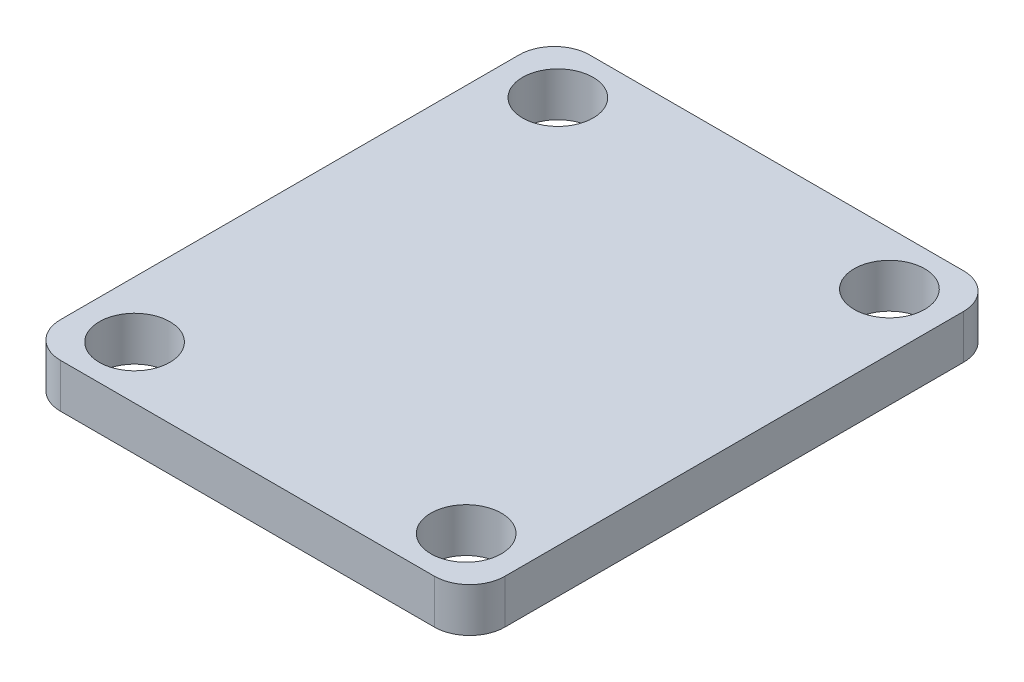
ISO-10303-21;
HEADER;
FILE_DESCRIPTION(('STEP AP214'),'2;1');
FILE_NAME('part.step','',(''),(''),'','','');
FILE_SCHEMA(('AUTOMOTIVE_DESIGN { 1 0 10303 214 1 1 1 1 }'));
ENDSEC;
DATA;
#1=APPLICATION_CONTEXT('core data for automotive mechanical design processes');
#2=APPLICATION_PROTOCOL_DEFINITION('international standard','automotive_design',2000,#1);
#3=PRODUCT_CONTEXT('',#1,'mechanical');
#4=PRODUCT('Part','Part','',(#3));
#5=PRODUCT_RELATED_PRODUCT_CATEGORY('part','',(#4));
#6=PRODUCT_DEFINITION_FORMATION('','',#4);
#7=PRODUCT_DEFINITION_CONTEXT('part definition',#1,'design');
#8=PRODUCT_DEFINITION('design','',#6,#7);
#9=PRODUCT_DEFINITION_SHAPE('','',#8);
#10=(LENGTH_UNIT() NAMED_UNIT(*) SI_UNIT(.MILLI.,.METRE.));
#11=(NAMED_UNIT(*) PLANE_ANGLE_UNIT() SI_UNIT($,.RADIAN.));
#12=(NAMED_UNIT(*) SI_UNIT($,.STERADIAN.) SOLID_ANGLE_UNIT());
#13=UNCERTAINTY_MEASURE_WITH_UNIT(LENGTH_MEASURE(1.E-05),#10,'distance_accuracy_value','');
#14=(GEOMETRIC_REPRESENTATION_CONTEXT(3) GLOBAL_UNCERTAINTY_ASSIGNED_CONTEXT((#13)) GLOBAL_UNIT_ASSIGNED_CONTEXT((#10,
#11,#12)) REPRESENTATION_CONTEXT('',''));
#15=CARTESIAN_POINT('',(0.,0.,0.));
#16=DIRECTION('',(0.,0.,1.));
#17=DIRECTION('',(1.,0.,0.));
#18=AXIS2_PLACEMENT_3D('',#15,#16,#17);
#19=CARTESIAN_POINT('',(-16.002,-3.175,19.05));
#20=DIRECTION('',(-1.,0.,0.));
#21=DIRECTION('',(0.,0.,1.));
#22=AXIS2_PLACEMENT_3D('',#19,#20,#21);
#23=PLANE('',#22);
#24=DIRECTION('',(0.,0.,1.));
#25=VECTOR('',#24,1.);
#26=CARTESIAN_POINT('',(-16.002,-3.175,19.05));
#27=LINE('',#26,#25);
#28=CARTESIAN_POINT('',(-16.002,-3.175,-16.51));
#29=VERTEX_POINT('',#28);
#30=CARTESIAN_POINT('',(-16.002,-3.175,16.51));
#31=VERTEX_POINT('',#30);
#32=EDGE_CURVE('E171',#29,#31,#27,.T.);
#33=ORIENTED_EDGE('',*,*,#32,.T.);
#34=DIRECTION('',(0.,1.,0.));
#35=VECTOR('',#34,1.);
#36=CARTESIAN_POINT('',(-16.002,-3.175,16.51));
#37=LINE('',#36,#35);
#38=CARTESIAN_POINT('',(-16.002,0.,16.51));
#39=VERTEX_POINT('',#38);
#40=EDGE_CURVE('E125',#31,#39,#37,.T.);
#41=ORIENTED_EDGE('',*,*,#40,.T.);
#42=DIRECTION('',(0.,0.,1.));
#43=VECTOR('',#42,1.);
#44=CARTESIAN_POINT('',(-16.002,0.,19.05));
#45=LINE('',#44,#43);
#46=CARTESIAN_POINT('',(-16.002,0.,-16.51));
#47=VERTEX_POINT('',#46);
#48=EDGE_CURVE('E109',#47,#39,#45,.T.);
#49=ORIENTED_EDGE('',*,*,#48,.F.);
#50=DIRECTION('',(0.,1.,0.));
#51=VECTOR('',#50,1.);
#52=CARTESIAN_POINT('',(-16.002,-3.175,-16.51));
#53=LINE('',#52,#51);
#54=EDGE_CURVE('E122',#47,#29,#53,.F.);
#55=ORIENTED_EDGE('',*,*,#54,.T.);
#56=EDGE_LOOP('',(#33,#41,#49,#55));
#57=FACE_BOUND('',#56,.T.);
#58=ADVANCED_FACE('F40',(#57),#23,.T.);
#59=CARTESIAN_POINT('',(16.002,-3.175,-19.05));
#60=DIRECTION('',(0.,0.,-1.));
#61=DIRECTION('',(-1.,0.,0.));
#62=AXIS2_PLACEMENT_3D('',#59,#60,#61);
#63=PLANE('',#62);
#64=DIRECTION('',(-1.,0.,0.));
#65=VECTOR('',#64,1.);
#66=CARTESIAN_POINT('',(16.002,-3.175,-19.05));
#67=LINE('',#66,#65);
#68=CARTESIAN_POINT('',(13.462,-3.175,-19.05));
#69=VERTEX_POINT('',#68);
#70=CARTESIAN_POINT('',(-13.462,-3.175,-19.05));
#71=VERTEX_POINT('',#70);
#72=EDGE_CURVE('E132',#69,#71,#67,.T.);
#73=ORIENTED_EDGE('',*,*,#72,.T.);
#74=DIRECTION('',(0.,1.,0.));
#75=VECTOR('',#74,1.);
#76=CARTESIAN_POINT('',(-13.462,-3.175,-19.05));
#77=LINE('',#76,#75);
#78=CARTESIAN_POINT('',(-13.462,0.,-19.05));
#79=VERTEX_POINT('',#78);
#80=EDGE_CURVE('E158',#71,#79,#77,.T.);
#81=ORIENTED_EDGE('',*,*,#80,.T.);
#82=DIRECTION('',(-1.,0.,0.));
#83=VECTOR('',#82,1.);
#84=CARTESIAN_POINT('',(16.002,0.,-19.05));
#85=LINE('',#84,#83);
#86=CARTESIAN_POINT('',(13.462,0.,-19.05));
#87=VERTEX_POINT('',#86);
#88=EDGE_CURVE('E111',#87,#79,#85,.T.);
#89=ORIENTED_EDGE('',*,*,#88,.F.);
#90=DIRECTION('',(0.,1.,0.));
#91=VECTOR('',#90,1.);
#92=CARTESIAN_POINT('',(13.462,-3.175,-19.05));
#93=LINE('',#92,#91);
#94=EDGE_CURVE('E156',#87,#69,#93,.F.);
#95=ORIENTED_EDGE('',*,*,#94,.T.);
#96=EDGE_LOOP('',(#73,#81,#89,#95));
#97=FACE_BOUND('',#96,.T.);
#98=ADVANCED_FACE('F160',(#97),#63,.T.);
#99=CARTESIAN_POINT('',(16.002,-3.175,19.05));
#100=DIRECTION('',(1.,0.,0.));
#101=DIRECTION('',(0.,0.,-1.));
#102=AXIS2_PLACEMENT_3D('',#99,#100,#101);
#103=PLANE('',#102);
#104=DIRECTION('',(0.,0.,-1.));
#105=VECTOR('',#104,1.);
#106=CARTESIAN_POINT('',(16.002,-3.175,19.05));
#107=LINE('',#106,#105);
#108=CARTESIAN_POINT('',(16.002,-3.175,16.51));
#109=VERTEX_POINT('',#108);
#110=CARTESIAN_POINT('',(16.002,-3.175,-16.51));
#111=VERTEX_POINT('',#110);
#112=EDGE_CURVE('E137',#109,#111,#107,.T.);
#113=ORIENTED_EDGE('',*,*,#112,.T.);
#114=DIRECTION('',(0.,1.,0.));
#115=VECTOR('',#114,1.);
#116=CARTESIAN_POINT('',(16.002,-3.175,-16.51));
#117=LINE('',#116,#115);
#118=CARTESIAN_POINT('',(16.002,0.,-16.51));
#119=VERTEX_POINT('',#118);
#120=EDGE_CURVE('E11',#111,#119,#117,.T.);
#121=ORIENTED_EDGE('',*,*,#120,.T.);
#122=DIRECTION('',(0.,0.,-1.));
#123=VECTOR('',#122,1.);
#124=CARTESIAN_POINT('',(16.002,0.,19.05));
#125=LINE('',#124,#123);
#126=CARTESIAN_POINT('',(16.002,0.,16.51));
#127=VERTEX_POINT('',#126);
#128=EDGE_CURVE('E169',#127,#119,#125,.T.);
#129=ORIENTED_EDGE('',*,*,#128,.F.);
#130=DIRECTION('',(0.,1.,0.));
#131=VECTOR('',#130,1.);
#132=CARTESIAN_POINT('',(16.002,-3.175,16.51));
#133=LINE('',#132,#131);
#134=EDGE_CURVE('E48',#127,#109,#133,.F.);
#135=ORIENTED_EDGE('',*,*,#134,.T.);
#136=EDGE_LOOP('',(#113,#121,#129,#135));
#137=FACE_BOUND('',#136,.T.);
#138=ADVANCED_FACE('F168',(#137),#103,.T.);
#139=CARTESIAN_POINT('',(16.002,-3.175,19.05));
#140=DIRECTION('',(0.,0.,1.));
#141=DIRECTION('',(1.,0.,0.));
#142=AXIS2_PLACEMENT_3D('',#139,#140,#141);
#143=PLANE('',#142);
#144=DIRECTION('',(1.,0.,0.));
#145=VECTOR('',#144,1.);
#146=CARTESIAN_POINT('',(16.002,0.,19.05));
#147=LINE('',#146,#145);
#148=CARTESIAN_POINT('',(-13.462,0.,19.05));
#149=VERTEX_POINT('',#148);
#150=CARTESIAN_POINT('',(13.462,0.,19.05));
#151=VERTEX_POINT('',#150);
#152=EDGE_CURVE('E126',#149,#151,#147,.T.);
#153=ORIENTED_EDGE('',*,*,#152,.F.);
#154=DIRECTION('',(0.,1.,0.));
#155=VECTOR('',#154,1.);
#156=CARTESIAN_POINT('',(-13.462,-3.175,19.05));
#157=LINE('',#156,#155);
#158=CARTESIAN_POINT('',(-13.462,-3.175,19.05));
#159=VERTEX_POINT('',#158);
#160=EDGE_CURVE('E148',#149,#159,#157,.F.);
#161=ORIENTED_EDGE('',*,*,#160,.T.);
#162=DIRECTION('',(1.,0.,0.));
#163=VECTOR('',#162,1.);
#164=CARTESIAN_POINT('',(16.002,-3.175,19.05));
#165=LINE('',#164,#163);
#166=CARTESIAN_POINT('',(13.462,-3.175,19.05));
#167=VERTEX_POINT('',#166);
#168=EDGE_CURVE('E175',#159,#167,#165,.T.);
#169=ORIENTED_EDGE('',*,*,#168,.T.);
#170=DIRECTION('',(0.,1.,0.));
#171=VECTOR('',#170,1.);
#172=CARTESIAN_POINT('',(13.462,-3.175,19.05));
#173=LINE('',#172,#171);
#174=EDGE_CURVE('E145',#167,#151,#173,.T.);
#175=ORIENTED_EDGE('',*,*,#174,.T.);
#176=EDGE_LOOP('',(#153,#161,#169,#175));
#177=FACE_BOUND('',#176,.T.);
#178=ADVANCED_FACE('F235',(#177),#143,.T.);
#179=CARTESIAN_POINT('',(0.,-3.175,0.));
#180=DIRECTION('',(0.,1.,0.));
#181=DIRECTION('',(0.,0.,1.));
#182=AXIS2_PLACEMENT_3D('',#179,#180,#181);
#183=PLANE('',#182);
#184=CARTESIAN_POINT('',(11.938,-3.175,15.24));
#185=DIRECTION('',(0.,1.,0.));
#186=DIRECTION('',(0.,0.,1.));
#187=AXIS2_PLACEMENT_3D('',#184,#185,#186);
#188=CIRCLE('',#187,2.54);
#189=CARTESIAN_POINT('',(11.938,-3.175,17.78));
#190=VERTEX_POINT('',#189);
#191=EDGE_CURVE('E188',#190,#190,#188,.T.);
#192=ORIENTED_EDGE('',*,*,#191,.T.);
#193=EDGE_LOOP('',(#192));
#194=FACE_BOUND('',#193,.T.);
#195=CARTESIAN_POINT('',(-11.938,-3.175,15.24));
#196=DIRECTION('',(0.,1.,0.));
#197=DIRECTION('',(0.,0.,1.));
#198=AXIS2_PLACEMENT_3D('',#195,#196,#197);
#199=CIRCLE('',#198,2.54);
#200=CARTESIAN_POINT('',(-11.938,-3.175,17.78));
#201=VERTEX_POINT('',#200);
#202=EDGE_CURVE('E194',#201,#201,#199,.T.);
#203=ORIENTED_EDGE('',*,*,#202,.T.);
#204=EDGE_LOOP('',(#203));
#205=FACE_BOUND('',#204,.T.);
#206=CARTESIAN_POINT('',(-11.938,-3.175,-15.24));
#207=DIRECTION('',(0.,1.,0.));
#208=DIRECTION('',(0.,0.,1.));
#209=AXIS2_PLACEMENT_3D('',#206,#207,#208);
#210=CIRCLE('',#209,2.54);
#211=CARTESIAN_POINT('',(-11.938,-3.175,-12.7));
#212=VERTEX_POINT('',#211);
#213=EDGE_CURVE('E182',#212,#212,#210,.T.);
#214=ORIENTED_EDGE('',*,*,#213,.T.);
#215=EDGE_LOOP('',(#214));
#216=FACE_BOUND('',#215,.T.);
#217=CARTESIAN_POINT('',(11.938,-3.175,-15.24));
#218=DIRECTION('',(0.,1.,0.));
#219=DIRECTION('',(0.,0.,1.));
#220=AXIS2_PLACEMENT_3D('',#217,#218,#219);
#221=CIRCLE('',#220,2.54);
#222=CARTESIAN_POINT('',(11.938,-3.175,-12.7));
#223=VERTEX_POINT('',#222);
#224=EDGE_CURVE('E127',#223,#223,#221,.T.);
#225=ORIENTED_EDGE('',*,*,#224,.T.);
#226=EDGE_LOOP('',(#225));
#227=FACE_BOUND('',#226,.T.);
#228=ORIENTED_EDGE('',*,*,#168,.F.);
#229=CARTESIAN_POINT('',(-13.462,-3.175,16.51));
#230=DIRECTION('',(0.,1.,0.));
#231=DIRECTION('',(0.,0.,1.));
#232=AXIS2_PLACEMENT_3D('',#229,#230,#231);
#233=CIRCLE('',#232,2.54);
#234=EDGE_CURVE('E154',#159,#31,#233,.F.);
#235=ORIENTED_EDGE('',*,*,#234,.T.);
#236=ORIENTED_EDGE('',*,*,#32,.F.);
#237=CARTESIAN_POINT('',(-13.462,-3.175,-16.51));
#238=DIRECTION('',(0.,1.,0.));
#239=DIRECTION('',(0.,0.,1.));
#240=AXIS2_PLACEMENT_3D('',#237,#238,#239);
#241=CIRCLE('',#240,2.54);
#242=EDGE_CURVE('E131',#29,#71,#241,.F.);
#243=ORIENTED_EDGE('',*,*,#242,.T.);
#244=ORIENTED_EDGE('',*,*,#72,.F.);
#245=CARTESIAN_POINT('',(13.462,-3.175,-16.51));
#246=DIRECTION('',(0.,1.,0.));
#247=DIRECTION('',(0.,0.,1.));
#248=AXIS2_PLACEMENT_3D('',#245,#246,#247);
#249=CIRCLE('',#248,2.54);
#250=EDGE_CURVE('E55',#69,#111,#249,.F.);
#251=ORIENTED_EDGE('',*,*,#250,.T.);
#252=ORIENTED_EDGE('',*,*,#112,.F.);
#253=CARTESIAN_POINT('',(13.462,-3.175,16.51));
#254=DIRECTION('',(0.,1.,0.));
#255=DIRECTION('',(0.,0.,1.));
#256=AXIS2_PLACEMENT_3D('',#253,#254,#255);
#257=CIRCLE('',#256,2.54);
#258=EDGE_CURVE('E150',#109,#167,#257,.F.);
#259=ORIENTED_EDGE('',*,*,#258,.T.);
#260=EDGE_LOOP('',(#228,#235,#236,#243,#244,#251,#252,#259));
#261=FACE_BOUND('',#260,.T.);
#262=ADVANCED_FACE('F163',(#194,#205,#216,#227,#261),#183,.F.);
#263=CARTESIAN_POINT('',(0.,0.,0.));
#264=DIRECTION('',(0.,1.,0.));
#265=DIRECTION('',(0.,0.,1.));
#266=AXIS2_PLACEMENT_3D('',#263,#264,#265);
#267=PLANE('',#266);
#268=CARTESIAN_POINT('',(11.938,0.,15.24));
#269=DIRECTION('',(0.,1.,0.));
#270=DIRECTION('',(0.,0.,1.));
#271=AXIS2_PLACEMENT_3D('',#268,#269,#270);
#272=CIRCLE('',#271,2.54);
#273=CARTESIAN_POINT('',(11.938,0.,17.78));
#274=VERTEX_POINT('',#273);
#275=EDGE_CURVE('E185',#274,#274,#272,.T.);
#276=ORIENTED_EDGE('',*,*,#275,.F.);
#277=EDGE_LOOP('',(#276));
#278=FACE_BOUND('',#277,.T.);
#279=CARTESIAN_POINT('',(-11.938,0.,15.24));
#280=DIRECTION('',(0.,1.,0.));
#281=DIRECTION('',(0.,0.,1.));
#282=AXIS2_PLACEMENT_3D('',#279,#280,#281);
#283=CIRCLE('',#282,2.54);
#284=CARTESIAN_POINT('',(-11.938,0.,17.78));
#285=VERTEX_POINT('',#284);
#286=EDGE_CURVE('E191',#285,#285,#283,.T.);
#287=ORIENTED_EDGE('',*,*,#286,.F.);
#288=EDGE_LOOP('',(#287));
#289=FACE_BOUND('',#288,.T.);
#290=CARTESIAN_POINT('',(-11.938,0.,-15.24));
#291=DIRECTION('',(0.,1.,0.));
#292=DIRECTION('',(0.,0.,1.));
#293=AXIS2_PLACEMENT_3D('',#290,#291,#292);
#294=CIRCLE('',#293,2.54);
#295=CARTESIAN_POINT('',(-11.938,0.,-12.7));
#296=VERTEX_POINT('',#295);
#297=EDGE_CURVE('E197',#296,#296,#294,.T.);
#298=ORIENTED_EDGE('',*,*,#297,.F.);
#299=EDGE_LOOP('',(#298));
#300=FACE_BOUND('',#299,.T.);
#301=CARTESIAN_POINT('',(11.938,0.,-15.24));
#302=DIRECTION('',(0.,1.,0.));
#303=DIRECTION('',(0.,0.,1.));
#304=AXIS2_PLACEMENT_3D('',#301,#302,#303);
#305=CIRCLE('',#304,2.54);
#306=CARTESIAN_POINT('',(11.938,0.,-12.7));
#307=VERTEX_POINT('',#306);
#308=EDGE_CURVE('E179',#307,#307,#305,.T.);
#309=ORIENTED_EDGE('',*,*,#308,.F.);
#310=EDGE_LOOP('',(#309));
#311=FACE_BOUND('',#310,.T.);
#312=ORIENTED_EDGE('',*,*,#48,.T.);
#313=CARTESIAN_POINT('',(-13.462,0.,16.51));
#314=DIRECTION('',(0.,1.,0.));
#315=DIRECTION('',(0.,0.,1.));
#316=AXIS2_PLACEMENT_3D('',#313,#314,#315);
#317=CIRCLE('',#316,2.54);
#318=EDGE_CURVE('E116',#39,#149,#317,.T.);
#319=ORIENTED_EDGE('',*,*,#318,.T.);
#320=ORIENTED_EDGE('',*,*,#152,.T.);
#321=CARTESIAN_POINT('',(13.462,0.,16.51));
#322=DIRECTION('',(0.,1.,0.));
#323=DIRECTION('',(0.,0.,1.));
#324=AXIS2_PLACEMENT_3D('',#321,#322,#323);
#325=CIRCLE('',#324,2.54);
#326=EDGE_CURVE('E134',#151,#127,#325,.T.);
#327=ORIENTED_EDGE('',*,*,#326,.T.);
#328=ORIENTED_EDGE('',*,*,#128,.T.);
#329=CARTESIAN_POINT('',(13.462,0.,-16.51));
#330=DIRECTION('',(0.,1.,0.));
#331=DIRECTION('',(0.,0.,1.));
#332=AXIS2_PLACEMENT_3D('',#329,#330,#331);
#333=CIRCLE('',#332,2.54);
#334=EDGE_CURVE('E117',#119,#87,#333,.T.);
#335=ORIENTED_EDGE('',*,*,#334,.T.);
#336=ORIENTED_EDGE('',*,*,#88,.T.);
#337=CARTESIAN_POINT('',(-13.462,0.,-16.51));
#338=DIRECTION('',(0.,1.,0.));
#339=DIRECTION('',(0.,0.,1.));
#340=AXIS2_PLACEMENT_3D('',#337,#338,#339);
#341=CIRCLE('',#340,2.54);
#342=EDGE_CURVE('E106',#79,#47,#341,.T.);
#343=ORIENTED_EDGE('',*,*,#342,.T.);
#344=EDGE_LOOP('',(#312,#319,#320,#327,#328,#335,#336,#343));
#345=FACE_BOUND('',#344,.T.);
#346=ADVANCED_FACE('F108',(#278,#289,#300,#311,#345),#267,.T.);
#347=CARTESIAN_POINT('',(11.938,-3.175,-15.24));
#348=DIRECTION('',(0.,1.,0.));
#349=DIRECTION('',(0.,0.,1.));
#350=AXIS2_PLACEMENT_3D('',#347,#348,#349);
#351=CYLINDRICAL_SURFACE('',#350,2.54);
#352=ORIENTED_EDGE('',*,*,#224,.F.);
#353=EDGE_LOOP('',(#352));
#354=FACE_BOUND('',#353,.T.);
#355=ORIENTED_EDGE('',*,*,#308,.T.);
#356=EDGE_LOOP('',(#355));
#357=FACE_BOUND('',#356,.T.);
#358=ADVANCED_FACE('F209',(#354,#357),#351,.F.);
#359=CARTESIAN_POINT('',(-11.938,-3.175,-15.24));
#360=DIRECTION('',(0.,1.,0.));
#361=DIRECTION('',(0.,0.,1.));
#362=AXIS2_PLACEMENT_3D('',#359,#360,#361);
#363=CYLINDRICAL_SURFACE('',#362,2.54);
#364=ORIENTED_EDGE('',*,*,#213,.F.);
#365=EDGE_LOOP('',(#364));
#366=FACE_BOUND('',#365,.T.);
#367=ORIENTED_EDGE('',*,*,#297,.T.);
#368=EDGE_LOOP('',(#367));
#369=FACE_BOUND('',#368,.T.);
#370=ADVANCED_FACE('F205',(#366,#369),#363,.F.);
#371=CARTESIAN_POINT('',(-11.938,-3.175,15.24));
#372=DIRECTION('',(0.,1.,0.));
#373=DIRECTION('',(0.,0.,1.));
#374=AXIS2_PLACEMENT_3D('',#371,#372,#373);
#375=CYLINDRICAL_SURFACE('',#374,2.54);
#376=ORIENTED_EDGE('',*,*,#202,.F.);
#377=EDGE_LOOP('',(#376));
#378=FACE_BOUND('',#377,.T.);
#379=ORIENTED_EDGE('',*,*,#286,.T.);
#380=EDGE_LOOP('',(#379));
#381=FACE_BOUND('',#380,.T.);
#382=ADVANCED_FACE('F208',(#378,#381),#375,.F.);
#383=CARTESIAN_POINT('',(11.938,-3.175,15.24));
#384=DIRECTION('',(0.,1.,0.));
#385=DIRECTION('',(0.,0.,1.));
#386=AXIS2_PLACEMENT_3D('',#383,#384,#385);
#387=CYLINDRICAL_SURFACE('',#386,2.54);
#388=ORIENTED_EDGE('',*,*,#191,.F.);
#389=EDGE_LOOP('',(#388));
#390=FACE_BOUND('',#389,.T.);
#391=ORIENTED_EDGE('',*,*,#275,.T.);
#392=EDGE_LOOP('',(#391));
#393=FACE_BOUND('',#392,.T.);
#394=ADVANCED_FACE('F240',(#390,#393),#387,.F.);
#395=CARTESIAN_POINT('',(-13.462,-3.175,16.51));
#396=DIRECTION('',(0.,1.,0.));
#397=DIRECTION('',(0.,0.,1.));
#398=AXIS2_PLACEMENT_3D('',#395,#396,#397);
#399=CYLINDRICAL_SURFACE('',#398,2.54);
#400=ORIENTED_EDGE('',*,*,#234,.F.);
#401=ORIENTED_EDGE('',*,*,#160,.F.);
#402=ORIENTED_EDGE('',*,*,#318,.F.);
#403=ORIENTED_EDGE('',*,*,#40,.F.);
#404=EDGE_LOOP('',(#400,#401,#402,#403));
#405=FACE_BOUND('',#404,.T.);
#406=ADVANCED_FACE('F237',(#405),#399,.T.);
#407=CARTESIAN_POINT('',(-13.462,-3.175,-16.51));
#408=DIRECTION('',(0.,1.,0.));
#409=DIRECTION('',(0.,0.,1.));
#410=AXIS2_PLACEMENT_3D('',#407,#408,#409);
#411=CYLINDRICAL_SURFACE('',#410,2.54);
#412=ORIENTED_EDGE('',*,*,#242,.F.);
#413=ORIENTED_EDGE('',*,*,#54,.F.);
#414=ORIENTED_EDGE('',*,*,#342,.F.);
#415=ORIENTED_EDGE('',*,*,#80,.F.);
#416=EDGE_LOOP('',(#412,#413,#414,#415));
#417=FACE_BOUND('',#416,.T.);
#418=ADVANCED_FACE('F130',(#417),#411,.T.);
#419=CARTESIAN_POINT('',(13.462,-3.175,-16.51));
#420=DIRECTION('',(0.,1.,0.));
#421=DIRECTION('',(0.,0.,1.));
#422=AXIS2_PLACEMENT_3D('',#419,#420,#421);
#423=CYLINDRICAL_SURFACE('',#422,2.54);
#424=ORIENTED_EDGE('',*,*,#250,.F.);
#425=ORIENTED_EDGE('',*,*,#94,.F.);
#426=ORIENTED_EDGE('',*,*,#334,.F.);
#427=ORIENTED_EDGE('',*,*,#120,.F.);
#428=EDGE_LOOP('',(#424,#425,#426,#427));
#429=FACE_BOUND('',#428,.T.);
#430=ADVANCED_FACE('F166',(#429),#423,.T.);
#431=CARTESIAN_POINT('',(13.462,-3.175,16.51));
#432=DIRECTION('',(0.,1.,0.));
#433=DIRECTION('',(0.,0.,1.));
#434=AXIS2_PLACEMENT_3D('',#431,#432,#433);
#435=CYLINDRICAL_SURFACE('',#434,2.54);
#436=ORIENTED_EDGE('',*,*,#258,.F.);
#437=ORIENTED_EDGE('',*,*,#134,.F.);
#438=ORIENTED_EDGE('',*,*,#326,.F.);
#439=ORIENTED_EDGE('',*,*,#174,.F.);
#440=EDGE_LOOP('',(#436,#437,#438,#439));
#441=FACE_BOUND('',#440,.T.);
#442=ADVANCED_FACE('F42',(#441),#435,.T.);
#443=CLOSED_SHELL('',(#58,#98,#138,#178,#262,#346,#358,#370,#382,#394,#406,#418,#430,#442));
#444=MANIFOLD_SOLID_BREP('B2',#443);
#445=ADVANCED_BREP_SHAPE_REPRESENTATION('',(#18,#444),#14);
#446=SHAPE_DEFINITION_REPRESENTATION(#9,#445);
ENDSEC;
END-ISO-10303-21;
